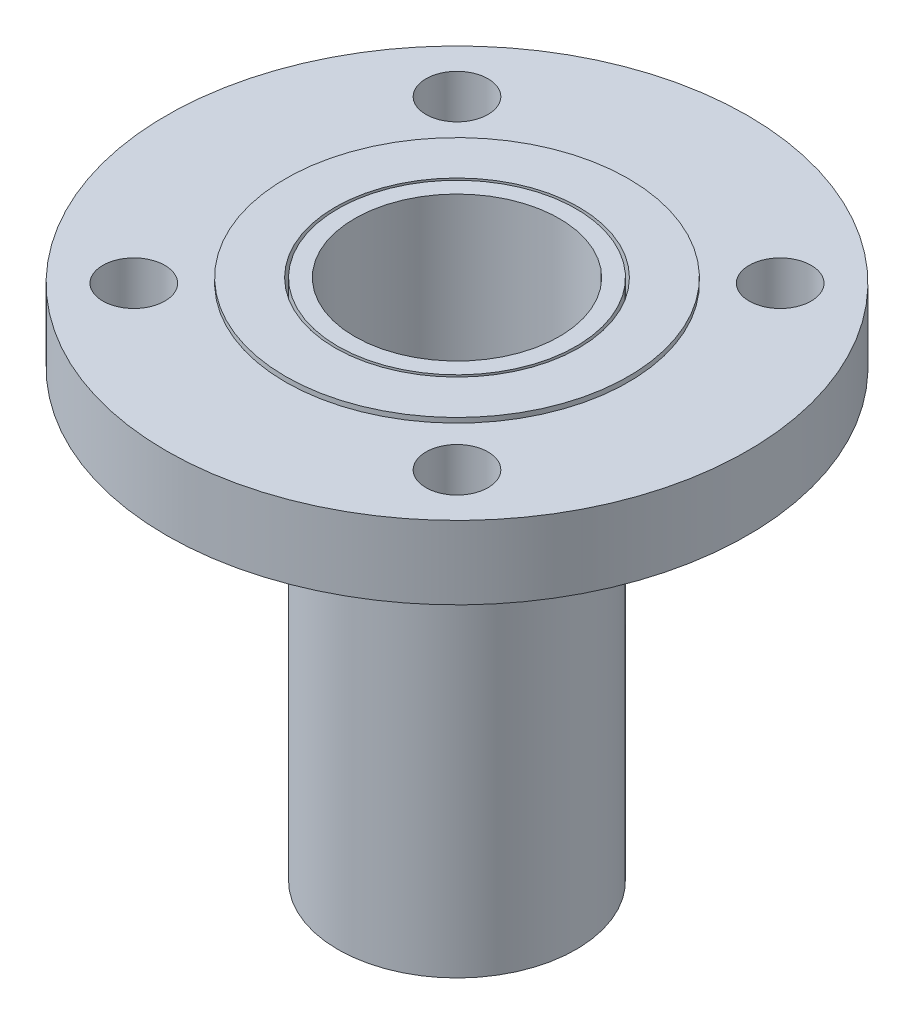
ISO-10303-21;
HEADER;
FILE_DESCRIPTION(('STEP AP214'),'2;1');
FILE_NAME('part.step','',(''),(''),'','','');
FILE_SCHEMA(('AUTOMOTIVE_DESIGN { 1 0 10303 214 1 1 1 1 }'));
ENDSEC;
DATA;
#1=APPLICATION_CONTEXT('core data for automotive mechanical design processes');
#2=APPLICATION_PROTOCOL_DEFINITION('international standard','automotive_design',2000,#1);
#3=PRODUCT_CONTEXT('',#1,'mechanical');
#4=PRODUCT('Part','Part','',(#3));
#5=PRODUCT_RELATED_PRODUCT_CATEGORY('part','',(#4));
#6=PRODUCT_DEFINITION_FORMATION('','',#4);
#7=PRODUCT_DEFINITION_CONTEXT('part definition',#1,'design');
#8=PRODUCT_DEFINITION('design','',#6,#7);
#9=PRODUCT_DEFINITION_SHAPE('','',#8);
#10=(LENGTH_UNIT() NAMED_UNIT(*) SI_UNIT(.MILLI.,.METRE.));
#11=(NAMED_UNIT(*) PLANE_ANGLE_UNIT() SI_UNIT($,.RADIAN.));
#12=(NAMED_UNIT(*) SI_UNIT($,.STERADIAN.) SOLID_ANGLE_UNIT());
#13=UNCERTAINTY_MEASURE_WITH_UNIT(LENGTH_MEASURE(1.E-05),#10,'distance_accuracy_value','');
#14=(GEOMETRIC_REPRESENTATION_CONTEXT(3) GLOBAL_UNCERTAINTY_ASSIGNED_CONTEXT((#13)) GLOBAL_UNIT_ASSIGNED_CONTEXT((#10,
#11,#12)) REPRESENTATION_CONTEXT('',''));
#15=CARTESIAN_POINT('',(0.,0.,0.));
#16=DIRECTION('',(0.,0.,1.));
#17=DIRECTION('',(1.,0.,0.));
#18=AXIS2_PLACEMENT_3D('',#15,#16,#17);
#19=CARTESIAN_POINT('',(0.,-136.1,0.));
#20=DIRECTION('',(0.,1.,0.));
#21=DIRECTION('',(0.,0.,1.));
#22=AXIS2_PLACEMENT_3D('',#19,#20,#21);
#23=CYLINDRICAL_SURFACE('',#22,36.5);
#24=CARTESIAN_POINT('',(0.,-136.1,0.));
#25=DIRECTION('',(0.,1.,0.));
#26=DIRECTION('',(0.,0.,1.));
#27=AXIS2_PLACEMENT_3D('',#24,#25,#26);
#28=CIRCLE('',#27,36.5);
#29=CARTESIAN_POINT('',(0.,-136.1,36.5));
#30=VERTEX_POINT('',#29);
#31=EDGE_CURVE('E11',#30,#30,#28,.T.);
#32=ORIENTED_EDGE('',*,*,#31,.T.);
#33=EDGE_LOOP('',(#32));
#34=FACE_BOUND('',#33,.T.);
#35=CARTESIAN_POINT('',(0.,23.9,0.));
#36=DIRECTION('',(0.,1.,0.));
#37=DIRECTION('',(0.,0.,1.));
#38=AXIS2_PLACEMENT_3D('',#35,#36,#37);
#39=CIRCLE('',#38,36.5);
#40=CARTESIAN_POINT('',(0.,23.9,36.5));
#41=VERTEX_POINT('',#40);
#42=EDGE_CURVE('E41',#41,#41,#39,.T.);
#43=ORIENTED_EDGE('',*,*,#42,.F.);
#44=EDGE_LOOP('',(#43));
#45=FACE_BOUND('',#44,.T.);
#46=ADVANCED_FACE('F38',(#34,#45),#23,.T.);
#47=CARTESIAN_POINT('',(0.,-136.1,0.));
#48=DIRECTION('',(0.,1.,0.));
#49=DIRECTION('',(0.,0.,1.));
#50=AXIS2_PLACEMENT_3D('',#47,#48,#49);
#51=PLANE('',#50);
#52=CARTESIAN_POINT('',(0.,-136.1,0.));
#53=DIRECTION('',(0.,1.,0.));
#54=DIRECTION('',(0.,0.,1.));
#55=AXIS2_PLACEMENT_3D('',#52,#53,#54);
#56=CIRCLE('',#55,31.34);
#57=CARTESIAN_POINT('',(0.,-136.1,31.34));
#58=VERTEX_POINT('',#57);
#59=EDGE_CURVE('E48',#58,#58,#56,.T.);
#60=ORIENTED_EDGE('',*,*,#59,.T.);
#61=EDGE_LOOP('',(#60));
#62=FACE_BOUND('',#61,.T.);
#63=ORIENTED_EDGE('',*,*,#31,.F.);
#64=EDGE_LOOP('',(#63));
#65=FACE_BOUND('',#64,.T.);
#66=ADVANCED_FACE('F56',(#62,#65),#51,.F.);
#67=CARTESIAN_POINT('',(0.,23.9,0.));
#68=DIRECTION('',(0.,1.,0.));
#69=DIRECTION('',(0.,0.,1.));
#70=AXIS2_PLACEMENT_3D('',#67,#68,#69);
#71=PLANE('',#70);
#72=CARTESIAN_POINT('',(0.,23.9,0.));
#73=DIRECTION('',(0.,1.,0.));
#74=DIRECTION('',(0.,0.,1.));
#75=AXIS2_PLACEMENT_3D('',#72,#73,#74);
#76=CIRCLE('',#75,31.34);
#77=CARTESIAN_POINT('',(0.,23.9,31.34));
#78=VERTEX_POINT('',#77);
#79=EDGE_CURVE('E50',#78,#78,#76,.T.);
#80=ORIENTED_EDGE('',*,*,#79,.F.);
#81=EDGE_LOOP('',(#80));
#82=FACE_BOUND('',#81,.T.);
#83=ORIENTED_EDGE('',*,*,#42,.T.);
#84=EDGE_LOOP('',(#83));
#85=FACE_BOUND('',#84,.T.);
#86=ADVANCED_FACE('F62',(#82,#85),#71,.T.);
#87=CARTESIAN_POINT('',(0.,-136.1,0.));
#88=DIRECTION('',(0.,1.,0.));
#89=DIRECTION('',(0.,0.,1.));
#90=AXIS2_PLACEMENT_3D('',#87,#88,#89);
#91=CYLINDRICAL_SURFACE('',#90,31.34);
#92=ORIENTED_EDGE('',*,*,#59,.F.);
#93=EDGE_LOOP('',(#92));
#94=FACE_BOUND('',#93,.T.);
#95=ORIENTED_EDGE('',*,*,#79,.T.);
#96=EDGE_LOOP('',(#95));
#97=FACE_BOUND('',#96,.T.);
#98=ADVANCED_FACE('F59',(#94,#97),#91,.F.);
#99=CLOSED_SHELL('',(#46,#66,#86,#98));
#100=MANIFOLD_SOLID_BREP('B2',#99);
#101=CARTESIAN_POINT('',(0.,22.4,0.));
#102=DIRECTION('',(0.,1.,0.));
#103=DIRECTION('',(0.,0.,1.));
#104=AXIS2_PLACEMENT_3D('',#101,#102,#103);
#105=PLANE('',#104);
#106=CARTESIAN_POINT('',(49.4974746830584,22.4,-49.4974746830582));
#107=DIRECTION('',(0.,1.,0.));
#108=DIRECTION('',(0.,0.,-1.));
#109=AXIS2_PLACEMENT_3D('',#106,#107,#108);
#110=CIRCLE('',#109,9.5);
#111=CARTESIAN_POINT('',(49.4974746830584,22.4,-58.9974746830582));
#112=VERTEX_POINT('',#111);
#113=EDGE_CURVE('E130',#112,#112,#110,.T.);
#114=ORIENTED_EDGE('',*,*,#113,.F.);
#115=EDGE_LOOP('',(#114));
#116=FACE_BOUND('',#115,.T.);
#117=CARTESIAN_POINT('',(-49.4974746830584,22.4,49.4974746830582));
#118=DIRECTION('',(0.,1.,0.));
#119=DIRECTION('',(0.,0.,-1.));
#120=AXIS2_PLACEMENT_3D('',#117,#118,#119);
#121=CIRCLE('',#120,9.5);
#122=CARTESIAN_POINT('',(-49.4974746830584,22.4,39.9974746830582));
#123=VERTEX_POINT('',#122);
#124=EDGE_CURVE('E118',#123,#123,#121,.T.);
#125=ORIENTED_EDGE('',*,*,#124,.F.);
#126=EDGE_LOOP('',(#125));
#127=FACE_BOUND('',#126,.T.);
#128=CARTESIAN_POINT('',(0.,22.4,0.));
#129=DIRECTION('',(0.,1.,0.));
#130=DIRECTION('',(0.,0.,1.));
#131=AXIS2_PLACEMENT_3D('',#128,#129,#130);
#132=CIRCLE('',#131,89.);
#133=CARTESIAN_POINT('',(0.,22.4,89.));
#134=VERTEX_POINT('',#133);
#135=EDGE_CURVE('E37',#134,#134,#132,.T.);
#136=ORIENTED_EDGE('',*,*,#135,.T.);
#137=EDGE_LOOP('',(#136));
#138=FACE_BOUND('',#137,.T.);
#139=CARTESIAN_POINT('',(-49.4974746830584,22.4,-49.4974746830582));
#140=DIRECTION('',(0.,1.,0.));
#141=DIRECTION('',(0.,0.,1.));
#142=AXIS2_PLACEMENT_3D('',#139,#140,#141);
#143=CIRCLE('',#142,9.5);
#144=CARTESIAN_POINT('',(-49.4974746830584,22.4,-39.9974746830582));
#145=VERTEX_POINT('',#144);
#146=EDGE_CURVE('E114',#145,#145,#143,.T.);
#147=ORIENTED_EDGE('',*,*,#146,.F.);
#148=EDGE_LOOP('',(#147));
#149=FACE_BOUND('',#148,.T.);
#150=CARTESIAN_POINT('',(49.4974746830584,22.4,49.4974746830582));
#151=DIRECTION('',(0.,1.,0.));
#152=DIRECTION('',(0.,0.,1.));
#153=AXIS2_PLACEMENT_3D('',#150,#151,#152);
#154=CIRCLE('',#153,9.5);
#155=CARTESIAN_POINT('',(49.4974746830584,22.4,58.9974746830582));
#156=VERTEX_POINT('',#155);
#157=EDGE_CURVE('E124',#156,#156,#154,.T.);
#158=ORIENTED_EDGE('',*,*,#157,.F.);
#159=EDGE_LOOP('',(#158));
#160=FACE_BOUND('',#159,.T.);
#161=CARTESIAN_POINT('',(0.,22.4,0.));
#162=DIRECTION('',(0.,1.,0.));
#163=DIRECTION('',(0.,0.,1.));
#164=AXIS2_PLACEMENT_3D('',#161,#162,#163);
#165=CIRCLE('',#164,52.5);
#166=CARTESIAN_POINT('',(0.,22.4,52.5));
#167=VERTEX_POINT('',#166);
#168=EDGE_CURVE('E139',#167,#167,#165,.T.);
#169=ORIENTED_EDGE('',*,*,#168,.F.);
#170=EDGE_LOOP('',(#169));
#171=FACE_BOUND('',#170,.T.);
#172=ADVANCED_FACE('F99',(#116,#127,#138,#149,#160,#171),#105,.T.);
#173=CARTESIAN_POINT('',(0.,0.,0.));
#174=DIRECTION('',(0.,1.,0.));
#175=DIRECTION('',(0.,0.,1.));
#176=AXIS2_PLACEMENT_3D('',#173,#174,#175);
#177=PLANE('',#176);
#178=CARTESIAN_POINT('',(0.,0.,0.));
#179=DIRECTION('',(0.,1.,0.));
#180=DIRECTION('',(0.,0.,1.));
#181=AXIS2_PLACEMENT_3D('',#178,#179,#180);
#182=CIRCLE('',#181,89.);
#183=CARTESIAN_POINT('',(0.,0.,89.));
#184=VERTEX_POINT('',#183);
#185=EDGE_CURVE('E103',#184,#184,#182,.T.);
#186=ORIENTED_EDGE('',*,*,#185,.F.);
#187=EDGE_LOOP('',(#186));
#188=FACE_BOUND('',#187,.T.);
#189=CARTESIAN_POINT('',(0.,0.,0.));
#190=DIRECTION('',(0.,1.,0.));
#191=DIRECTION('',(0.,0.,1.));
#192=AXIS2_PLACEMENT_3D('',#189,#190,#191);
#193=CIRCLE('',#192,37.35);
#194=CARTESIAN_POINT('',(0.,0.,37.35));
#195=VERTEX_POINT('',#194);
#196=EDGE_CURVE('E110',#195,#195,#193,.T.);
#197=ORIENTED_EDGE('',*,*,#196,.T.);
#198=EDGE_LOOP('',(#197));
#199=FACE_BOUND('',#198,.T.);
#200=CARTESIAN_POINT('',(-49.4974746830584,0.,-49.4974746830582));
#201=DIRECTION('',(0.,1.,0.));
#202=DIRECTION('',(0.,0.,1.));
#203=AXIS2_PLACEMENT_3D('',#200,#201,#202);
#204=CIRCLE('',#203,9.5);
#205=CARTESIAN_POINT('',(-49.4974746830584,0.,-39.9974746830582));
#206=VERTEX_POINT('',#205);
#207=EDGE_CURVE('E115',#206,#206,#204,.T.);
#208=ORIENTED_EDGE('',*,*,#207,.T.);
#209=EDGE_LOOP('',(#208));
#210=FACE_BOUND('',#209,.T.);
#211=CARTESIAN_POINT('',(-49.4974746830584,0.,49.4974746830582));
#212=DIRECTION('',(0.,1.,0.));
#213=DIRECTION('',(0.,0.,-1.));
#214=AXIS2_PLACEMENT_3D('',#211,#212,#213);
#215=CIRCLE('',#214,9.5);
#216=CARTESIAN_POINT('',(-49.4974746830584,0.,39.9974746830582));
#217=VERTEX_POINT('',#216);
#218=EDGE_CURVE('E121',#217,#217,#215,.T.);
#219=ORIENTED_EDGE('',*,*,#218,.T.);
#220=EDGE_LOOP('',(#219));
#221=FACE_BOUND('',#220,.T.);
#222=CARTESIAN_POINT('',(49.4974746830584,0.,49.4974746830582));
#223=DIRECTION('',(0.,1.,0.));
#224=DIRECTION('',(0.,0.,1.));
#225=AXIS2_PLACEMENT_3D('',#222,#223,#224);
#226=CIRCLE('',#225,9.5);
#227=CARTESIAN_POINT('',(49.4974746830584,0.,58.9974746830582));
#228=VERTEX_POINT('',#227);
#229=EDGE_CURVE('E127',#228,#228,#226,.T.);
#230=ORIENTED_EDGE('',*,*,#229,.T.);
#231=EDGE_LOOP('',(#230));
#232=FACE_BOUND('',#231,.T.);
#233=CARTESIAN_POINT('',(49.4974746830584,0.,-49.4974746830582));
#234=DIRECTION('',(0.,1.,0.));
#235=DIRECTION('',(0.,0.,-1.));
#236=AXIS2_PLACEMENT_3D('',#233,#234,#235);
#237=CIRCLE('',#236,9.5);
#238=CARTESIAN_POINT('',(49.4974746830584,0.,-58.9974746830582));
#239=VERTEX_POINT('',#238);
#240=EDGE_CURVE('E133',#239,#239,#237,.T.);
#241=ORIENTED_EDGE('',*,*,#240,.T.);
#242=EDGE_LOOP('',(#241));
#243=FACE_BOUND('',#242,.T.);
#244=ADVANCED_FACE('F166',(#188,#199,#210,#221,#232,#243),#177,.F.);
#245=CARTESIAN_POINT('',(0.,22.4,0.));
#246=DIRECTION('',(0.,-1.,0.));
#247=DIRECTION('',(0.,0.,-1.));
#248=AXIS2_PLACEMENT_3D('',#245,#246,#247);
#249=CYLINDRICAL_SURFACE('',#248,89.);
#250=ORIENTED_EDGE('',*,*,#135,.F.);
#251=EDGE_LOOP('',(#250));
#252=FACE_BOUND('',#251,.T.);
#253=ORIENTED_EDGE('',*,*,#185,.T.);
#254=EDGE_LOOP('',(#253));
#255=FACE_BOUND('',#254,.T.);
#256=ADVANCED_FACE('F101',(#252,#255),#249,.T.);
#257=CARTESIAN_POINT('',(0.,22.4,0.));
#258=DIRECTION('',(0.,-1.,0.));
#259=DIRECTION('',(0.,0.,-1.));
#260=AXIS2_PLACEMENT_3D('',#257,#258,#259);
#261=CYLINDRICAL_SURFACE('',#260,37.35);
#262=ORIENTED_EDGE('',*,*,#196,.F.);
#263=EDGE_LOOP('',(#262));
#264=FACE_BOUND('',#263,.T.);
#265=CARTESIAN_POINT('',(0.,23.9,0.));
#266=DIRECTION('',(0.,1.,0.));
#267=DIRECTION('',(0.,0.,1.));
#268=AXIS2_PLACEMENT_3D('',#265,#266,#267);
#269=CIRCLE('',#268,37.35);
#270=CARTESIAN_POINT('',(0.,23.9,37.35));
#271=VERTEX_POINT('',#270);
#272=EDGE_CURVE('E142',#271,#271,#269,.T.);
#273=ORIENTED_EDGE('',*,*,#272,.T.);
#274=EDGE_LOOP('',(#273));
#275=FACE_BOUND('',#274,.T.);
#276=ADVANCED_FACE('F148',(#264,#275),#261,.F.);
#277=CARTESIAN_POINT('',(-49.4974746830584,22.4,-49.4974746830582));
#278=DIRECTION('',(0.,-1.,0.));
#279=DIRECTION('',(0.,0.,-1.));
#280=AXIS2_PLACEMENT_3D('',#277,#278,#279);
#281=CYLINDRICAL_SURFACE('',#280,9.5);
#282=ORIENTED_EDGE('',*,*,#146,.T.);
#283=EDGE_LOOP('',(#282));
#284=FACE_BOUND('',#283,.T.);
#285=ORIENTED_EDGE('',*,*,#207,.F.);
#286=EDGE_LOOP('',(#285));
#287=FACE_BOUND('',#286,.T.);
#288=ADVANCED_FACE('F178',(#284,#287),#281,.F.);
#289=CARTESIAN_POINT('',(-49.4974746830584,22.4,49.4974746830582));
#290=DIRECTION('',(0.,-1.,0.));
#291=DIRECTION('',(0.,0.,-1.));
#292=AXIS2_PLACEMENT_3D('',#289,#290,#291);
#293=CYLINDRICAL_SURFACE('',#292,9.5);
#294=ORIENTED_EDGE('',*,*,#124,.T.);
#295=EDGE_LOOP('',(#294));
#296=FACE_BOUND('',#295,.T.);
#297=ORIENTED_EDGE('',*,*,#218,.F.);
#298=EDGE_LOOP('',(#297));
#299=FACE_BOUND('',#298,.T.);
#300=ADVANCED_FACE('F182',(#296,#299),#293,.F.);
#301=CARTESIAN_POINT('',(49.4974746830584,22.4,49.4974746830582));
#302=DIRECTION('',(0.,-1.,0.));
#303=DIRECTION('',(0.,0.,-1.));
#304=AXIS2_PLACEMENT_3D('',#301,#302,#303);
#305=CYLINDRICAL_SURFACE('',#304,9.5);
#306=ORIENTED_EDGE('',*,*,#157,.T.);
#307=EDGE_LOOP('',(#306));
#308=FACE_BOUND('',#307,.T.);
#309=ORIENTED_EDGE('',*,*,#229,.F.);
#310=EDGE_LOOP('',(#309));
#311=FACE_BOUND('',#310,.T.);
#312=ADVANCED_FACE('F162',(#308,#311),#305,.F.);
#313=CARTESIAN_POINT('',(49.4974746830584,22.4,-49.4974746830582));
#314=DIRECTION('',(0.,-1.,0.));
#315=DIRECTION('',(0.,0.,-1.));
#316=AXIS2_PLACEMENT_3D('',#313,#314,#315);
#317=CYLINDRICAL_SURFACE('',#316,9.5);
#318=ORIENTED_EDGE('',*,*,#113,.T.);
#319=EDGE_LOOP('',(#318));
#320=FACE_BOUND('',#319,.T.);
#321=ORIENTED_EDGE('',*,*,#240,.F.);
#322=EDGE_LOOP('',(#321));
#323=FACE_BOUND('',#322,.T.);
#324=ADVANCED_FACE('F153',(#320,#323),#317,.F.);
#325=CARTESIAN_POINT('',(0.,23.9,0.));
#326=DIRECTION('',(0.,1.,0.));
#327=DIRECTION('',(0.,0.,1.));
#328=AXIS2_PLACEMENT_3D('',#325,#326,#327);
#329=PLANE('',#328);
#330=CARTESIAN_POINT('',(0.,23.9,0.));
#331=DIRECTION('',(0.,1.,0.));
#332=DIRECTION('',(0.,0.,1.));
#333=AXIS2_PLACEMENT_3D('',#330,#331,#332);
#334=CIRCLE('',#333,52.5);
#335=CARTESIAN_POINT('',(0.,23.9,52.5));
#336=VERTEX_POINT('',#335);
#337=EDGE_CURVE('E136',#336,#336,#334,.T.);
#338=ORIENTED_EDGE('',*,*,#337,.T.);
#339=EDGE_LOOP('',(#338));
#340=FACE_BOUND('',#339,.T.);
#341=ORIENTED_EDGE('',*,*,#272,.F.);
#342=EDGE_LOOP('',(#341));
#343=FACE_BOUND('',#342,.T.);
#344=ADVANCED_FACE('F150',(#340,#343),#329,.T.);
#345=CARTESIAN_POINT('',(0.,23.9,0.));
#346=DIRECTION('',(0.,-1.,0.));
#347=DIRECTION('',(0.,0.,-1.));
#348=AXIS2_PLACEMENT_3D('',#345,#346,#347);
#349=CYLINDRICAL_SURFACE('',#348,52.5);
#350=ORIENTED_EDGE('',*,*,#337,.F.);
#351=EDGE_LOOP('',(#350));
#352=FACE_BOUND('',#351,.T.);
#353=ORIENTED_EDGE('',*,*,#168,.T.);
#354=EDGE_LOOP('',(#353));
#355=FACE_BOUND('',#354,.T.);
#356=ADVANCED_FACE('F152',(#352,#355),#349,.T.);
#357=CLOSED_SHELL('',(#172,#244,#256,#276,#288,#300,#312,#324,#344,#356));
#358=MANIFOLD_SOLID_BREP('B6',#357);
#359=ADVANCED_BREP_SHAPE_REPRESENTATION('',(#18,#100,#358),#14);
#360=SHAPE_DEFINITION_REPRESENTATION(#9,#359);
ENDSEC;
END-ISO-10303-21;
